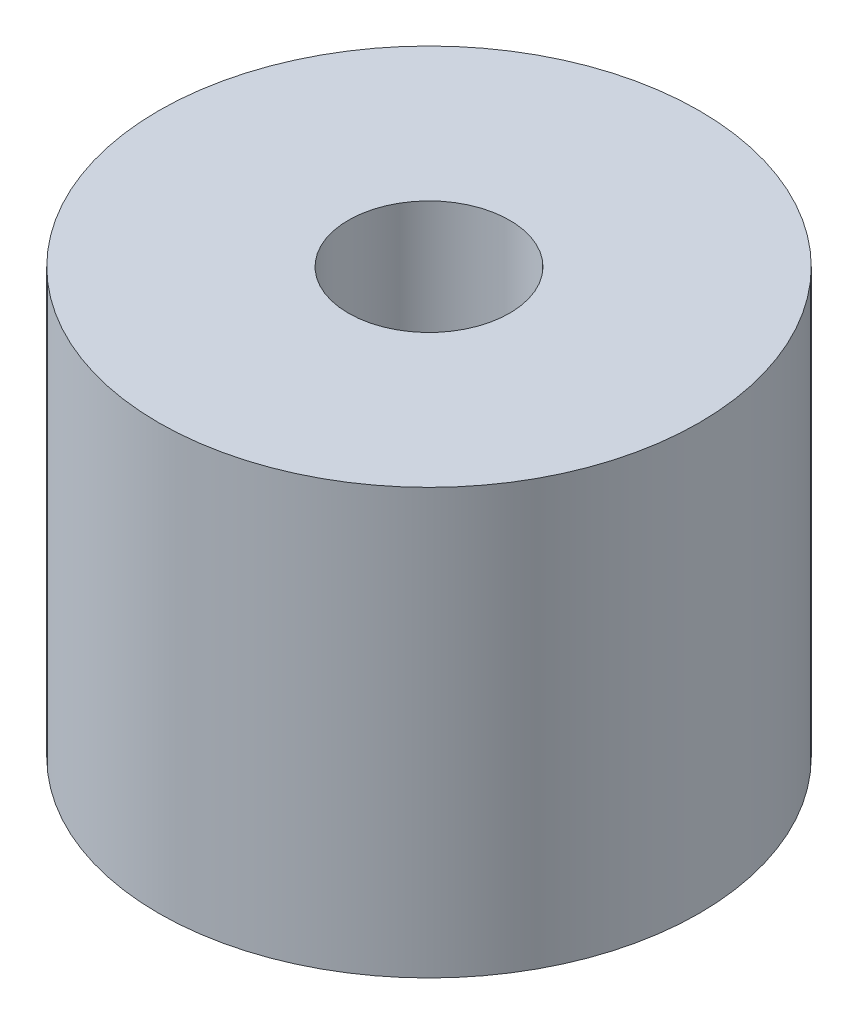
ISO-10303-21;
HEADER;
FILE_DESCRIPTION(('STEP AP214'),'2;1');
FILE_NAME('part.step','',(''),(''),'','','');
FILE_SCHEMA(('AUTOMOTIVE_DESIGN { 1 0 10303 214 1 1 1 1 }'));
ENDSEC;
DATA;
#1=APPLICATION_CONTEXT('core data for automotive mechanical design processes');
#2=APPLICATION_PROTOCOL_DEFINITION('international standard','automotive_design',2000,#1);
#3=PRODUCT_CONTEXT('',#1,'mechanical');
#4=PRODUCT('Part','Part','',(#3));
#5=PRODUCT_RELATED_PRODUCT_CATEGORY('part','',(#4));
#6=PRODUCT_DEFINITION_FORMATION('','',#4);
#7=PRODUCT_DEFINITION_CONTEXT('part definition',#1,'design');
#8=PRODUCT_DEFINITION('design','',#6,#7);
#9=PRODUCT_DEFINITION_SHAPE('','',#8);
#10=(LENGTH_UNIT() NAMED_UNIT(*) SI_UNIT(.MILLI.,.METRE.));
#11=(NAMED_UNIT(*) PLANE_ANGLE_UNIT() SI_UNIT($,.RADIAN.));
#12=(NAMED_UNIT(*) SI_UNIT($,.STERADIAN.) SOLID_ANGLE_UNIT());
#13=UNCERTAINTY_MEASURE_WITH_UNIT(LENGTH_MEASURE(1.E-05),#10,'distance_accuracy_value','');
#14=(GEOMETRIC_REPRESENTATION_CONTEXT(3) GLOBAL_UNCERTAINTY_ASSIGNED_CONTEXT((#13)) GLOBAL_UNIT_ASSIGNED_CONTEXT((#10,
#11,#12)) REPRESENTATION_CONTEXT('',''));
#15=CARTESIAN_POINT('',(0.,0.,0.));
#16=DIRECTION('',(0.,0.,1.));
#17=DIRECTION('',(1.,0.,0.));
#18=AXIS2_PLACEMENT_3D('',#15,#16,#17);
#19=CARTESIAN_POINT('',(0.,22.4,0.));
#20=DIRECTION('',(0.,1.,0.));
#21=DIRECTION('',(0.,0.,1.));
#22=AXIS2_PLACEMENT_3D('',#19,#20,#21);
#23=PLANE('',#22);
#24=CARTESIAN_POINT('',(0.,22.4,0.));
#25=DIRECTION('',(0.,1.,0.));
#26=DIRECTION('',(0.,0.,1.));
#27=AXIS2_PLACEMENT_3D('',#24,#25,#26);
#28=CIRCLE('',#27,14.25);
#29=CARTESIAN_POINT('',(0.,22.4,14.25));
#30=VERTEX_POINT('',#29);
#31=EDGE_CURVE('E10',#30,#30,#28,.T.);
#32=ORIENTED_EDGE('',*,*,#31,.T.);
#33=EDGE_LOOP('',(#32));
#34=FACE_BOUND('',#33,.T.);
#35=CARTESIAN_POINT('',(0.,22.4,0.));
#36=DIRECTION('',(0.,1.,0.));
#37=DIRECTION('',(0.,0.,1.));
#38=AXIS2_PLACEMENT_3D('',#35,#36,#37);
#39=CIRCLE('',#38,4.25);
#40=CARTESIAN_POINT('',(0.,22.4,4.25));
#41=VERTEX_POINT('',#40);
#42=EDGE_CURVE('E45',#41,#41,#39,.T.);
#43=ORIENTED_EDGE('',*,*,#42,.F.);
#44=EDGE_LOOP('',(#43));
#45=FACE_BOUND('',#44,.T.);
#46=ADVANCED_FACE('F34',(#34,#45),#23,.T.);
#47=CARTESIAN_POINT('',(0.,0.,0.));
#48=DIRECTION('',(0.,1.,0.));
#49=DIRECTION('',(0.,0.,1.));
#50=AXIS2_PLACEMENT_3D('',#47,#48,#49);
#51=PLANE('',#50);
#52=CARTESIAN_POINT('',(0.,0.,0.));
#53=DIRECTION('',(0.,1.,0.));
#54=DIRECTION('',(0.,0.,1.));
#55=AXIS2_PLACEMENT_3D('',#52,#53,#54);
#56=CIRCLE('',#55,14.25);
#57=CARTESIAN_POINT('',(0.,0.,14.25));
#58=VERTEX_POINT('',#57);
#59=EDGE_CURVE('E38',#58,#58,#56,.T.);
#60=ORIENTED_EDGE('',*,*,#59,.F.);
#61=EDGE_LOOP('',(#60));
#62=FACE_BOUND('',#61,.T.);
#63=CARTESIAN_POINT('',(0.,0.,0.));
#64=DIRECTION('',(0.,1.,0.));
#65=DIRECTION('',(0.,0.,1.));
#66=AXIS2_PLACEMENT_3D('',#63,#64,#65);
#67=CIRCLE('',#66,4.25);
#68=CARTESIAN_POINT('',(0.,0.,4.25));
#69=VERTEX_POINT('',#68);
#70=EDGE_CURVE('E47',#69,#69,#67,.T.);
#71=ORIENTED_EDGE('',*,*,#70,.T.);
#72=EDGE_LOOP('',(#71));
#73=FACE_BOUND('',#72,.T.);
#74=ADVANCED_FACE('F57',(#62,#73),#51,.F.);
#75=CARTESIAN_POINT('',(0.,22.4,0.));
#76=DIRECTION('',(0.,-1.,0.));
#77=DIRECTION('',(0.,0.,-1.));
#78=AXIS2_PLACEMENT_3D('',#75,#76,#77);
#79=CYLINDRICAL_SURFACE('',#78,14.25);
#80=ORIENTED_EDGE('',*,*,#31,.F.);
#81=EDGE_LOOP('',(#80));
#82=FACE_BOUND('',#81,.T.);
#83=ORIENTED_EDGE('',*,*,#59,.T.);
#84=EDGE_LOOP('',(#83));
#85=FACE_BOUND('',#84,.T.);
#86=ADVANCED_FACE('F36',(#82,#85),#79,.T.);
#87=CARTESIAN_POINT('',(0.,22.4,0.));
#88=DIRECTION('',(0.,-1.,0.));
#89=DIRECTION('',(0.,0.,-1.));
#90=AXIS2_PLACEMENT_3D('',#87,#88,#89);
#91=CYLINDRICAL_SURFACE('',#90,4.25);
#92=ORIENTED_EDGE('',*,*,#42,.T.);
#93=EDGE_LOOP('',(#92));
#94=FACE_BOUND('',#93,.T.);
#95=ORIENTED_EDGE('',*,*,#70,.F.);
#96=EDGE_LOOP('',(#95));
#97=FACE_BOUND('',#96,.T.);
#98=ADVANCED_FACE('F53',(#94,#97),#91,.F.);
#99=CLOSED_SHELL('',(#46,#74,#86,#98));
#100=MANIFOLD_SOLID_BREP('B2',#99);
#101=ADVANCED_BREP_SHAPE_REPRESENTATION('',(#18,#100),#14);
#102=SHAPE_DEFINITION_REPRESENTATION(#9,#101);
ENDSEC;
END-ISO-10303-21;
